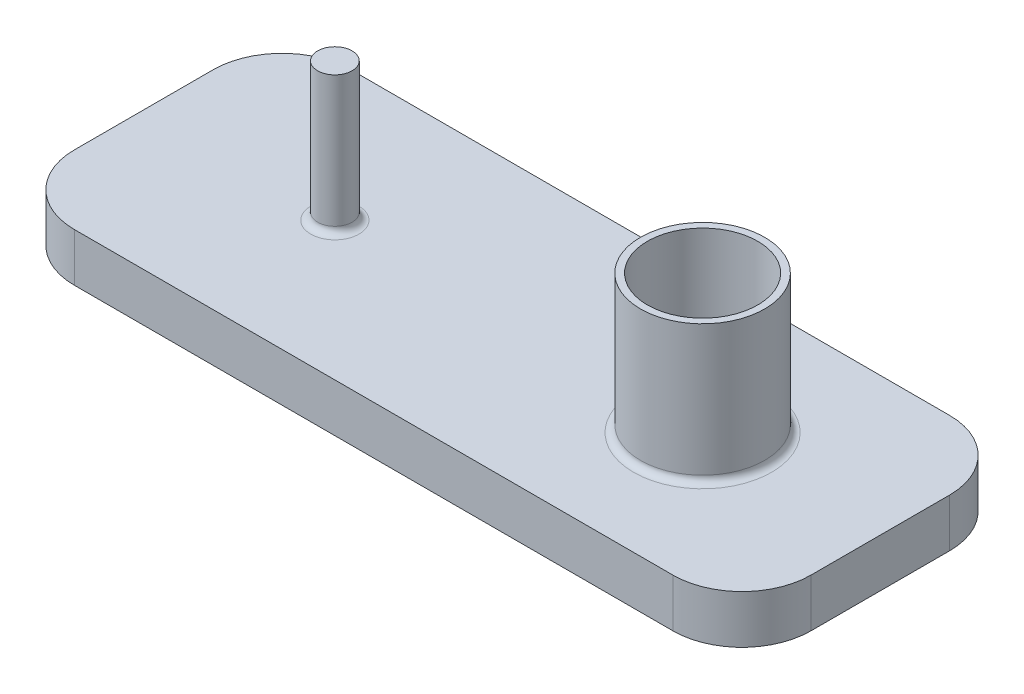
ISO-10303-21;
HEADER;
FILE_DESCRIPTION(('STEP AP214'),'2;1');
FILE_NAME('part.step','',(''),(''),'','','');
FILE_SCHEMA(('AUTOMOTIVE_DESIGN { 1 0 10303 214 1 1 1 1 }'));
ENDSEC;
DATA;
#1=APPLICATION_CONTEXT('core data for automotive mechanical design processes');
#2=APPLICATION_PROTOCOL_DEFINITION('international standard','automotive_design',2000,#1);
#3=PRODUCT_CONTEXT('',#1,'mechanical');
#4=PRODUCT('Part','Part','',(#3));
#5=PRODUCT_RELATED_PRODUCT_CATEGORY('part','',(#4));
#6=PRODUCT_DEFINITION_FORMATION('','',#4);
#7=PRODUCT_DEFINITION_CONTEXT('part definition',#1,'design');
#8=PRODUCT_DEFINITION('design','',#6,#7);
#9=PRODUCT_DEFINITION_SHAPE('','',#8);
#10=(LENGTH_UNIT() NAMED_UNIT(*) SI_UNIT(.MILLI.,.METRE.));
#11=(NAMED_UNIT(*) PLANE_ANGLE_UNIT() SI_UNIT($,.RADIAN.));
#12=(NAMED_UNIT(*) SI_UNIT($,.STERADIAN.) SOLID_ANGLE_UNIT());
#13=UNCERTAINTY_MEASURE_WITH_UNIT(LENGTH_MEASURE(1.E-05),#10,'distance_accuracy_value','');
#14=(GEOMETRIC_REPRESENTATION_CONTEXT(3) GLOBAL_UNCERTAINTY_ASSIGNED_CONTEXT((#13)) GLOBAL_UNIT_ASSIGNED_CONTEXT((#10,
#11,#12)) REPRESENTATION_CONTEXT('',''));
#15=CARTESIAN_POINT('',(0.,0.,0.));
#16=DIRECTION('',(0.,0.,1.));
#17=DIRECTION('',(1.,0.,0.));
#18=AXIS2_PLACEMENT_3D('',#15,#16,#17);
#19=CARTESIAN_POINT('',(126.696687149001,35.,13.8997789351463));
#20=DIRECTION('',(0.,-1.,0.));
#21=DIRECTION('',(0.,0.,-1.));
#22=AXIS2_PLACEMENT_3D('',#19,#20,#21);
#23=CYLINDRICAL_SURFACE('',#22,50.);
#24=CARTESIAN_POINT('',(126.696687149001,0.,13.8997789351463));
#25=DIRECTION('',(0.,1.,0.));
#26=DIRECTION('',(0.,0.,1.));
#27=AXIS2_PLACEMENT_3D('',#24,#25,#26);
#28=CIRCLE('',#27,50.);
#29=CARTESIAN_POINT('',(176.696687149001,0.,13.8997789351466));
#30=VERTEX_POINT('',#29);
#31=CARTESIAN_POINT('',(126.696687149,0.,-36.1002210648537));
#32=VERTEX_POINT('',#31);
#33=EDGE_CURVE('E139',#30,#32,#28,.T.);
#34=ORIENTED_EDGE('',*,*,#33,.T.);
#35=DIRECTION('',(0.,-1.,0.));
#36=VECTOR('',#35,1.);
#37=CARTESIAN_POINT('',(126.696687149,35.,-36.1002210648537));
#38=LINE('',#37,#36);
#39=CARTESIAN_POINT('',(126.696687149,35.,-36.1002210648537));
#40=VERTEX_POINT('',#39);
#41=EDGE_CURVE('E167',#40,#32,#38,.T.);
#42=ORIENTED_EDGE('',*,*,#41,.F.);
#43=CARTESIAN_POINT('',(126.696687149001,35.,13.8997789351463));
#44=DIRECTION('',(0.,1.,0.));
#45=DIRECTION('',(0.,0.,1.));
#46=AXIS2_PLACEMENT_3D('',#43,#44,#45);
#47=CIRCLE('',#46,50.);
#48=CARTESIAN_POINT('',(176.696687149001,35.,13.8997789351466));
#49=VERTEX_POINT('',#48);
#50=EDGE_CURVE('E154',#49,#40,#47,.T.);
#51=ORIENTED_EDGE('',*,*,#50,.F.);
#52=DIRECTION('',(0.,-1.,0.));
#53=VECTOR('',#52,1.);
#54=CARTESIAN_POINT('',(176.696687149001,35.,13.8997789351466));
#55=LINE('',#54,#53);
#56=EDGE_CURVE('E135',#49,#30,#55,.T.);
#57=ORIENTED_EDGE('',*,*,#56,.T.);
#58=EDGE_LOOP('',(#34,#42,#51,#57));
#59=FACE_BOUND('',#58,.T.);
#60=ADVANCED_FACE('F41',(#59),#23,.T.);
#61=CARTESIAN_POINT('',(-306.955168869185,35.,-36.1002210648537));
#62=DIRECTION('',(0.,0.,1.));
#63=DIRECTION('',(1.,0.,0.));
#64=AXIS2_PLACEMENT_3D('',#61,#62,#63);
#65=PLANE('',#64);
#66=DIRECTION('',(-1.,0.,0.));
#67=VECTOR('',#66,1.);
#68=CARTESIAN_POINT('',(-306.955168869185,0.,-36.1002210648537));
#69=LINE('',#68,#67);
#70=CARTESIAN_POINT('',(-306.955168869185,0.,-36.1002210648537));
#71=VERTEX_POINT('',#70);
#72=EDGE_CURVE('E142',#32,#71,#69,.T.);
#73=ORIENTED_EDGE('',*,*,#72,.T.);
#74=DIRECTION('',(0.,-1.,0.));
#75=VECTOR('',#74,1.);
#76=CARTESIAN_POINT('',(-306.955168869185,35.,-36.1002210648537));
#77=LINE('',#76,#75);
#78=CARTESIAN_POINT('',(-306.955168869185,35.,-36.1002210648537));
#79=VERTEX_POINT('',#78);
#80=EDGE_CURVE('E164',#79,#71,#77,.T.);
#81=ORIENTED_EDGE('',*,*,#80,.F.);
#82=DIRECTION('',(-1.,0.,0.));
#83=VECTOR('',#82,1.);
#84=CARTESIAN_POINT('',(-306.955168869185,35.,-36.1002210648537));
#85=LINE('',#84,#83);
#86=EDGE_CURVE('E102',#40,#79,#85,.T.);
#87=ORIENTED_EDGE('',*,*,#86,.F.);
#88=ORIENTED_EDGE('',*,*,#41,.T.);
#89=EDGE_LOOP('',(#73,#81,#87,#88));
#90=FACE_BOUND('',#89,.T.);
#91=ADVANCED_FACE('F238',(#90),#65,.F.);
#92=CARTESIAN_POINT('',(-306.955168869185,35.,13.8997789351463));
#93=DIRECTION('',(0.,-1.,0.));
#94=DIRECTION('',(0.,0.,-1.));
#95=AXIS2_PLACEMENT_3D('',#92,#93,#94);
#96=CYLINDRICAL_SURFACE('',#95,50.);
#97=CARTESIAN_POINT('',(-306.955168869185,0.,13.8997789351463));
#98=DIRECTION('',(0.,1.,0.));
#99=DIRECTION('',(0.,0.,-1.));
#100=AXIS2_PLACEMENT_3D('',#97,#98,#99);
#101=CIRCLE('',#100,50.);
#102=CARTESIAN_POINT('',(-356.955168869185,0.,13.8997789351466));
#103=VERTEX_POINT('',#102);
#104=EDGE_CURVE('E145',#71,#103,#101,.T.);
#105=ORIENTED_EDGE('',*,*,#104,.T.);
#106=DIRECTION('',(0.,-1.,0.));
#107=VECTOR('',#106,1.);
#108=CARTESIAN_POINT('',(-356.955168869185,35.,13.8997789351466));
#109=LINE('',#108,#107);
#110=CARTESIAN_POINT('',(-356.955168869185,35.,13.8997789351466));
#111=VERTEX_POINT('',#110);
#112=EDGE_CURVE('E161',#111,#103,#109,.T.);
#113=ORIENTED_EDGE('',*,*,#112,.F.);
#114=CARTESIAN_POINT('',(-306.955168869185,35.,13.8997789351463));
#115=DIRECTION('',(0.,1.,0.));
#116=DIRECTION('',(0.,0.,-1.));
#117=AXIS2_PLACEMENT_3D('',#114,#115,#116);
#118=CIRCLE('',#117,50.);
#119=EDGE_CURVE('E206',#79,#111,#118,.T.);
#120=ORIENTED_EDGE('',*,*,#119,.F.);
#121=ORIENTED_EDGE('',*,*,#80,.T.);
#122=EDGE_LOOP('',(#105,#113,#120,#121));
#123=FACE_BOUND('',#122,.T.);
#124=ADVANCED_FACE('F243',(#123),#96,.T.);
#125=CARTESIAN_POINT('',(-356.955168869185,35.,114.344622415148));
#126=DIRECTION('',(1.,0.,0.));
#127=DIRECTION('',(0.,0.,-1.));
#128=AXIS2_PLACEMENT_3D('',#125,#126,#127);
#129=PLANE('',#128);
#130=DIRECTION('',(0.,0.,1.));
#131=VECTOR('',#130,1.);
#132=CARTESIAN_POINT('',(-356.955168869185,0.,114.344622415148));
#133=LINE('',#132,#131);
#134=CARTESIAN_POINT('',(-356.955168869185,0.,114.344622415148));
#135=VERTEX_POINT('',#134);
#136=EDGE_CURVE('E147',#103,#135,#133,.T.);
#137=ORIENTED_EDGE('',*,*,#136,.T.);
#138=DIRECTION('',(0.,-1.,0.));
#139=VECTOR('',#138,1.);
#140=CARTESIAN_POINT('',(-356.955168869185,35.,114.344622415148));
#141=LINE('',#140,#139);
#142=CARTESIAN_POINT('',(-356.955168869185,35.,114.344622415148));
#143=VERTEX_POINT('',#142);
#144=EDGE_CURVE('E158',#143,#135,#141,.T.);
#145=ORIENTED_EDGE('',*,*,#144,.F.);
#146=DIRECTION('',(0.,0.,1.));
#147=VECTOR('',#146,1.);
#148=CARTESIAN_POINT('',(-356.955168869185,35.,114.344622415148));
#149=LINE('',#148,#147);
#150=EDGE_CURVE('E208',#111,#143,#149,.T.);
#151=ORIENTED_EDGE('',*,*,#150,.F.);
#152=ORIENTED_EDGE('',*,*,#112,.T.);
#153=EDGE_LOOP('',(#137,#145,#151,#152));
#154=FACE_BOUND('',#153,.T.);
#155=ADVANCED_FACE('F214',(#154),#129,.F.);
#156=CARTESIAN_POINT('',(-306.955168869185,35.,114.344622415148));
#157=DIRECTION('',(0.,-1.,0.));
#158=DIRECTION('',(0.,0.,-1.));
#159=AXIS2_PLACEMENT_3D('',#156,#157,#158);
#160=CYLINDRICAL_SURFACE('',#159,50.);
#161=CARTESIAN_POINT('',(-306.955168869185,0.,114.344622415148));
#162=DIRECTION('',(0.,1.,0.));
#163=DIRECTION('',(0.,0.,1.));
#164=AXIS2_PLACEMENT_3D('',#161,#162,#163);
#165=CIRCLE('',#164,50.);
#166=CARTESIAN_POINT('',(-306.955168869185,0.,164.344622415148));
#167=VERTEX_POINT('',#166);
#168=EDGE_CURVE('E149',#135,#167,#165,.T.);
#169=ORIENTED_EDGE('',*,*,#168,.T.);
#170=DIRECTION('',(0.,-1.,0.));
#171=VECTOR('',#170,1.);
#172=CARTESIAN_POINT('',(-306.955168869185,35.,164.344622415148));
#173=LINE('',#172,#171);
#174=CARTESIAN_POINT('',(-306.955168869185,35.,164.344622415148));
#175=VERTEX_POINT('',#174);
#176=EDGE_CURVE('E130',#175,#167,#173,.T.);
#177=ORIENTED_EDGE('',*,*,#176,.F.);
#178=CARTESIAN_POINT('',(-306.955168869185,35.,114.344622415148));
#179=DIRECTION('',(0.,1.,0.));
#180=DIRECTION('',(0.,0.,1.));
#181=AXIS2_PLACEMENT_3D('',#178,#179,#180);
#182=CIRCLE('',#181,50.);
#183=EDGE_CURVE('E121',#143,#175,#182,.T.);
#184=ORIENTED_EDGE('',*,*,#183,.F.);
#185=ORIENTED_EDGE('',*,*,#144,.T.);
#186=EDGE_LOOP('',(#169,#177,#184,#185));
#187=FACE_BOUND('',#186,.T.);
#188=ADVANCED_FACE('F218',(#187),#160,.T.);
#189=CARTESIAN_POINT('',(-306.955168869185,35.,164.344622415148));
#190=DIRECTION('',(0.,0.,-1.));
#191=DIRECTION('',(-1.,0.,0.));
#192=AXIS2_PLACEMENT_3D('',#189,#190,#191);
#193=PLANE('',#192);
#194=DIRECTION('',(1.,0.,0.));
#195=VECTOR('',#194,1.);
#196=CARTESIAN_POINT('',(-306.955168869185,0.,164.344622415148));
#197=LINE('',#196,#195);
#198=CARTESIAN_POINT('',(126.696687149,0.,164.344622415148));
#199=VERTEX_POINT('',#198);
#200=EDGE_CURVE('E129',#167,#199,#197,.T.);
#201=ORIENTED_EDGE('',*,*,#200,.T.);
#202=DIRECTION('',(0.,-1.,0.));
#203=VECTOR('',#202,1.);
#204=CARTESIAN_POINT('',(126.696687149,35.,164.344622415148));
#205=LINE('',#204,#203);
#206=CARTESIAN_POINT('',(126.696687149,35.,164.344622415148));
#207=VERTEX_POINT('',#206);
#208=EDGE_CURVE('E126',#207,#199,#205,.T.);
#209=ORIENTED_EDGE('',*,*,#208,.F.);
#210=DIRECTION('',(1.,0.,0.));
#211=VECTOR('',#210,1.);
#212=CARTESIAN_POINT('',(-306.955168869185,35.,164.344622415148));
#213=LINE('',#212,#211);
#214=EDGE_CURVE('E115',#175,#207,#213,.T.);
#215=ORIENTED_EDGE('',*,*,#214,.F.);
#216=ORIENTED_EDGE('',*,*,#176,.T.);
#217=EDGE_LOOP('',(#201,#209,#215,#216));
#218=FACE_BOUND('',#217,.T.);
#219=ADVANCED_FACE('F127',(#218),#193,.F.);
#220=CARTESIAN_POINT('',(126.696687149001,35.,114.344622415148));
#221=DIRECTION('',(0.,-1.,0.));
#222=DIRECTION('',(0.,0.,-1.));
#223=AXIS2_PLACEMENT_3D('',#220,#221,#222);
#224=CYLINDRICAL_SURFACE('',#223,50.);
#225=CARTESIAN_POINT('',(126.696687149001,0.,114.344622415148));
#226=DIRECTION('',(0.,1.,0.));
#227=DIRECTION('',(0.,0.,1.));
#228=AXIS2_PLACEMENT_3D('',#225,#226,#227);
#229=CIRCLE('',#228,50.);
#230=CARTESIAN_POINT('',(176.696687149001,0.,114.344622415148));
#231=VERTEX_POINT('',#230);
#232=EDGE_CURVE('E87',#199,#231,#229,.T.);
#233=ORIENTED_EDGE('',*,*,#232,.T.);
#234=DIRECTION('',(0.,-1.,0.));
#235=VECTOR('',#234,1.);
#236=CARTESIAN_POINT('',(176.696687149001,35.,114.344622415148));
#237=LINE('',#236,#235);
#238=CARTESIAN_POINT('',(176.696687149001,35.,114.344622415148));
#239=VERTEX_POINT('',#238);
#240=EDGE_CURVE('E131',#239,#231,#237,.T.);
#241=ORIENTED_EDGE('',*,*,#240,.F.);
#242=CARTESIAN_POINT('',(126.696687149001,35.,114.344622415148));
#243=DIRECTION('',(0.,1.,0.));
#244=DIRECTION('',(0.,0.,1.));
#245=AXIS2_PLACEMENT_3D('',#242,#243,#244);
#246=CIRCLE('',#245,50.);
#247=EDGE_CURVE('E119',#207,#239,#246,.T.);
#248=ORIENTED_EDGE('',*,*,#247,.F.);
#249=ORIENTED_EDGE('',*,*,#208,.T.);
#250=EDGE_LOOP('',(#233,#241,#248,#249));
#251=FACE_BOUND('',#250,.T.);
#252=ADVANCED_FACE('F133',(#251),#224,.T.);
#253=CARTESIAN_POINT('',(176.696687149001,35.,114.344622415148));
#254=DIRECTION('',(-1.,0.,0.));
#255=DIRECTION('',(0.,0.,1.));
#256=AXIS2_PLACEMENT_3D('',#253,#254,#255);
#257=PLANE('',#256);
#258=DIRECTION('',(0.,0.,-1.));
#259=VECTOR('',#258,1.);
#260=CARTESIAN_POINT('',(176.696687149001,0.,114.344622415148));
#261=LINE('',#260,#259);
#262=EDGE_CURVE('E93',#231,#30,#261,.T.);
#263=ORIENTED_EDGE('',*,*,#262,.T.);
#264=ORIENTED_EDGE('',*,*,#56,.F.);
#265=DIRECTION('',(0.,0.,-1.));
#266=VECTOR('',#265,1.);
#267=CARTESIAN_POINT('',(176.696687149001,35.,114.344622415148));
#268=LINE('',#267,#266);
#269=EDGE_CURVE('E58',#239,#49,#268,.T.);
#270=ORIENTED_EDGE('',*,*,#269,.F.);
#271=ORIENTED_EDGE('',*,*,#240,.T.);
#272=EDGE_LOOP('',(#263,#264,#270,#271));
#273=FACE_BOUND('',#272,.T.);
#274=ADVANCED_FACE('F226',(#273),#257,.F.);
#275=CARTESIAN_POINT('',(126.696687149001,35.,13.8997789351463));
#276=DIRECTION('',(0.,1.,0.));
#277=DIRECTION('',(0.,0.,1.));
#278=AXIS2_PLACEMENT_3D('',#275,#276,#277);
#279=PLANE('',#278);
#280=CARTESIAN_POINT('',(47.9576093256728,35.,64.1222006751471));
#281=DIRECTION('',(0.,1.,0.));
#282=DIRECTION('',(0.,0.,1.));
#283=AXIS2_PLACEMENT_3D('',#280,#281,#282);
#284=CIRCLE('',#283,50.);
#285=CARTESIAN_POINT('',(47.9576093256728,35.,114.122200675147));
#286=VERTEX_POINT('',#285);
#287=EDGE_CURVE('E50',#286,#286,#284,.F.);
#288=ORIENTED_EDGE('',*,*,#287,.T.);
#289=EDGE_LOOP('',(#288));
#290=FACE_BOUND('',#289,.T.);
#291=CARTESIAN_POINT('',(-218.468493168707,35.,64.1222006751471));
#292=DIRECTION('',(0.,1.,0.));
#293=DIRECTION('',(0.,0.,1.));
#294=AXIS2_PLACEMENT_3D('',#291,#292,#293);
#295=CIRCLE('',#294,17.5);
#296=CARTESIAN_POINT('',(-218.468493168707,35.,81.6222006751471));
#297=VERTEX_POINT('',#296);
#298=EDGE_CURVE('E175',#297,#297,#295,.F.);
#299=ORIENTED_EDGE('',*,*,#298,.T.);
#300=EDGE_LOOP('',(#299));
#301=FACE_BOUND('',#300,.T.);
#302=ORIENTED_EDGE('',*,*,#50,.T.);
#303=ORIENTED_EDGE('',*,*,#86,.T.);
#304=ORIENTED_EDGE('',*,*,#119,.T.);
#305=ORIENTED_EDGE('',*,*,#150,.T.);
#306=ORIENTED_EDGE('',*,*,#183,.T.);
#307=ORIENTED_EDGE('',*,*,#214,.T.);
#308=ORIENTED_EDGE('',*,*,#247,.T.);
#309=ORIENTED_EDGE('',*,*,#269,.T.);
#310=EDGE_LOOP('',(#302,#303,#304,#305,#306,#307,#308,#309));
#311=FACE_BOUND('',#310,.T.);
#312=ADVANCED_FACE('F117',(#290,#301,#311),#279,.T.);
#313=CARTESIAN_POINT('',(126.696687149001,0.,13.8997789351463));
#314=DIRECTION('',(0.,1.,0.));
#315=DIRECTION('',(0.,0.,1.));
#316=AXIS2_PLACEMENT_3D('',#313,#314,#315);
#317=PLANE('',#316);
#318=ORIENTED_EDGE('',*,*,#33,.F.);
#319=ORIENTED_EDGE('',*,*,#262,.F.);
#320=ORIENTED_EDGE('',*,*,#232,.F.);
#321=ORIENTED_EDGE('',*,*,#200,.F.);
#322=ORIENTED_EDGE('',*,*,#168,.F.);
#323=ORIENTED_EDGE('',*,*,#136,.F.);
#324=ORIENTED_EDGE('',*,*,#104,.F.);
#325=ORIENTED_EDGE('',*,*,#72,.F.);
#326=EDGE_LOOP('',(#318,#319,#320,#321,#322,#323,#324,#325));
#327=FACE_BOUND('',#326,.T.);
#328=ADVANCED_FACE('F221',(#327),#317,.F.);
#329=CARTESIAN_POINT('',(47.9576093256728,135.,64.1222006751471));
#330=DIRECTION('',(0.,1.,0.));
#331=DIRECTION('',(0.,0.,1.));
#332=AXIS2_PLACEMENT_3D('',#329,#330,#331);
#333=PLANE('',#332);
#334=CARTESIAN_POINT('',(47.9576093256728,135.,64.1222006751471));
#335=DIRECTION('',(0.,1.,0.));
#336=DIRECTION('',(0.,0.,1.));
#337=AXIS2_PLACEMENT_3D('',#334,#335,#336);
#338=CIRCLE('',#337,45.);
#339=CARTESIAN_POINT('',(47.9576093256728,135.,109.122200675147));
#340=VERTEX_POINT('',#339);
#341=EDGE_CURVE('E196',#340,#340,#338,.T.);
#342=ORIENTED_EDGE('',*,*,#341,.T.);
#343=EDGE_LOOP('',(#342));
#344=FACE_BOUND('',#343,.T.);
#345=CARTESIAN_POINT('',(47.9576093256728,135.,64.1222006751471));
#346=DIRECTION('',(0.,1.,0.));
#347=DIRECTION('',(0.,0.,1.));
#348=AXIS2_PLACEMENT_3D('',#345,#346,#347);
#349=CIRCLE('',#348,40.);
#350=CARTESIAN_POINT('',(47.9576093256728,135.,104.122200675147));
#351=VERTEX_POINT('',#350);
#352=EDGE_CURVE('E198',#351,#351,#349,.T.);
#353=ORIENTED_EDGE('',*,*,#352,.F.);
#354=EDGE_LOOP('',(#353));
#355=FACE_BOUND('',#354,.T.);
#356=ADVANCED_FACE('F192',(#344,#355),#333,.T.);
#357=CARTESIAN_POINT('',(47.9576093256728,135.,64.1222006751471));
#358=DIRECTION('',(0.,-1.,0.));
#359=DIRECTION('',(0.,0.,-1.));
#360=AXIS2_PLACEMENT_3D('',#357,#358,#359);
#361=CYLINDRICAL_SURFACE('',#360,45.);
#362=CARTESIAN_POINT('',(47.9576093256728,40.,64.1222006751471));
#363=DIRECTION('',(0.,1.,0.));
#364=DIRECTION('',(0.,0.,1.));
#365=AXIS2_PLACEMENT_3D('',#362,#363,#364);
#366=CIRCLE('',#365,45.);
#367=CARTESIAN_POINT('',(47.9576093256728,40.,109.122200675147));
#368=VERTEX_POINT('',#367);
#369=EDGE_CURVE('E172',#368,#368,#366,.T.);
#370=ORIENTED_EDGE('',*,*,#369,.T.);
#371=EDGE_LOOP('',(#370));
#372=FACE_BOUND('',#371,.T.);
#373=ORIENTED_EDGE('',*,*,#341,.F.);
#374=EDGE_LOOP('',(#373));
#375=FACE_BOUND('',#374,.T.);
#376=ADVANCED_FACE('F188',(#372,#375),#361,.T.);
#377=CARTESIAN_POINT('',(47.9576093256728,135.,64.1222006751471));
#378=DIRECTION('',(0.,-1.,0.));
#379=DIRECTION('',(0.,0.,-1.));
#380=AXIS2_PLACEMENT_3D('',#377,#378,#379);
#381=CYLINDRICAL_SURFACE('',#380,40.);
#382=ORIENTED_EDGE('',*,*,#352,.T.);
#383=EDGE_LOOP('',(#382));
#384=FACE_BOUND('',#383,.T.);
#385=CARTESIAN_POINT('',(47.9576093256728,35.,64.1222006751471));
#386=DIRECTION('',(0.,1.,0.));
#387=DIRECTION('',(0.,0.,1.));
#388=AXIS2_PLACEMENT_3D('',#385,#386,#387);
#389=CIRCLE('',#388,40.);
#390=CARTESIAN_POINT('',(47.9576093256728,35.,104.122200675147));
#391=VERTEX_POINT('',#390);
#392=EDGE_CURVE('E169',#391,#391,#389,.F.);
#393=ORIENTED_EDGE('',*,*,#392,.T.);
#394=EDGE_LOOP('',(#393));
#395=FACE_BOUND('',#394,.T.);
#396=ADVANCED_FACE('F191',(#384,#395),#381,.F.);
#397=ORIENTED_EDGE('',*,*,#392,.F.);
#398=EDGE_LOOP('',(#397));
#399=FACE_BOUND('',#398,.T.);
#400=ADVANCED_FACE('F234',(#399),#279,.T.);
#401=CARTESIAN_POINT('',(-218.468493168707,135.,64.1222006751471));
#402=DIRECTION('',(0.,-1.,0.));
#403=DIRECTION('',(0.,0.,-1.));
#404=AXIS2_PLACEMENT_3D('',#401,#402,#403);
#405=CYLINDRICAL_SURFACE('',#404,12.5);
#406=CARTESIAN_POINT('',(-218.468493168707,40.,64.1222006751471));
#407=DIRECTION('',(0.,1.,0.));
#408=DIRECTION('',(0.,0.,1.));
#409=AXIS2_PLACEMENT_3D('',#406,#407,#408);
#410=CIRCLE('',#409,12.5);
#411=CARTESIAN_POINT('',(-218.468493168707,40.,76.6222006751471));
#412=VERTEX_POINT('',#411);
#413=EDGE_CURVE('E11',#412,#412,#410,.T.);
#414=ORIENTED_EDGE('',*,*,#413,.T.);
#415=EDGE_LOOP('',(#414));
#416=FACE_BOUND('',#415,.T.);
#417=CARTESIAN_POINT('',(-218.468493168707,135.,64.1222006751471));
#418=DIRECTION('',(0.,1.,0.));
#419=DIRECTION('',(0.,0.,1.));
#420=AXIS2_PLACEMENT_3D('',#417,#418,#419);
#421=CIRCLE('',#420,12.5);
#422=CARTESIAN_POINT('',(-218.468493168707,135.,76.6222006751471));
#423=VERTEX_POINT('',#422);
#424=EDGE_CURVE('E143',#423,#423,#421,.T.);
#425=ORIENTED_EDGE('',*,*,#424,.F.);
#426=EDGE_LOOP('',(#425));
#427=FACE_BOUND('',#426,.T.);
#428=ADVANCED_FACE('F291',(#416,#427),#405,.T.);
#429=CARTESIAN_POINT('',(-218.468493168707,135.,64.1222006751471));
#430=DIRECTION('',(0.,1.,0.));
#431=DIRECTION('',(0.,0.,1.));
#432=AXIS2_PLACEMENT_3D('',#429,#430,#431);
#433=PLANE('',#432);
#434=ORIENTED_EDGE('',*,*,#424,.T.);
#435=EDGE_LOOP('',(#434));
#436=FACE_BOUND('',#435,.T.);
#437=ADVANCED_FACE('F185',(#436),#433,.T.);
#438=CARTESIAN_POINT('',(47.9576093256728,40.,64.1222006751471));
#439=DIRECTION('',(0.,1.,0.));
#440=DIRECTION('',(0.,0.,1.));
#441=AXIS2_PLACEMENT_3D('',#438,#439,#440);
#442=TOROIDAL_SURFACE('',#441,50.,5.);
#443=ORIENTED_EDGE('',*,*,#287,.F.);
#444=EDGE_LOOP('',(#443));
#445=FACE_BOUND('',#444,.T.);
#446=ORIENTED_EDGE('',*,*,#369,.F.);
#447=EDGE_LOOP('',(#446));
#448=FACE_BOUND('',#447,.T.);
#449=ADVANCED_FACE('F182',(#445,#448),#442,.F.);
#450=CARTESIAN_POINT('',(-218.468493168707,40.,64.1222006751471));
#451=DIRECTION('',(0.,1.,0.));
#452=DIRECTION('',(0.,0.,1.));
#453=AXIS2_PLACEMENT_3D('',#450,#451,#452);
#454=TOROIDAL_SURFACE('',#453,17.5,5.);
#455=ORIENTED_EDGE('',*,*,#298,.F.);
#456=EDGE_LOOP('',(#455));
#457=FACE_BOUND('',#456,.T.);
#458=ORIENTED_EDGE('',*,*,#413,.F.);
#459=EDGE_LOOP('',(#458));
#460=FACE_BOUND('',#459,.T.);
#461=ADVANCED_FACE('F43',(#457,#460),#454,.F.);
#462=CLOSED_SHELL('',(#60,#91,#124,#155,#188,#219,#252,#274,#312,#328,#356,#376,#396,#400,#428,
#437,#449,#461));
#463=MANIFOLD_SOLID_BREP('B2',#462);
#464=ADVANCED_BREP_SHAPE_REPRESENTATION('',(#18,#463),#14);
#465=SHAPE_DEFINITION_REPRESENTATION(#9,#464);
ENDSEC;
END-ISO-10303-21;
